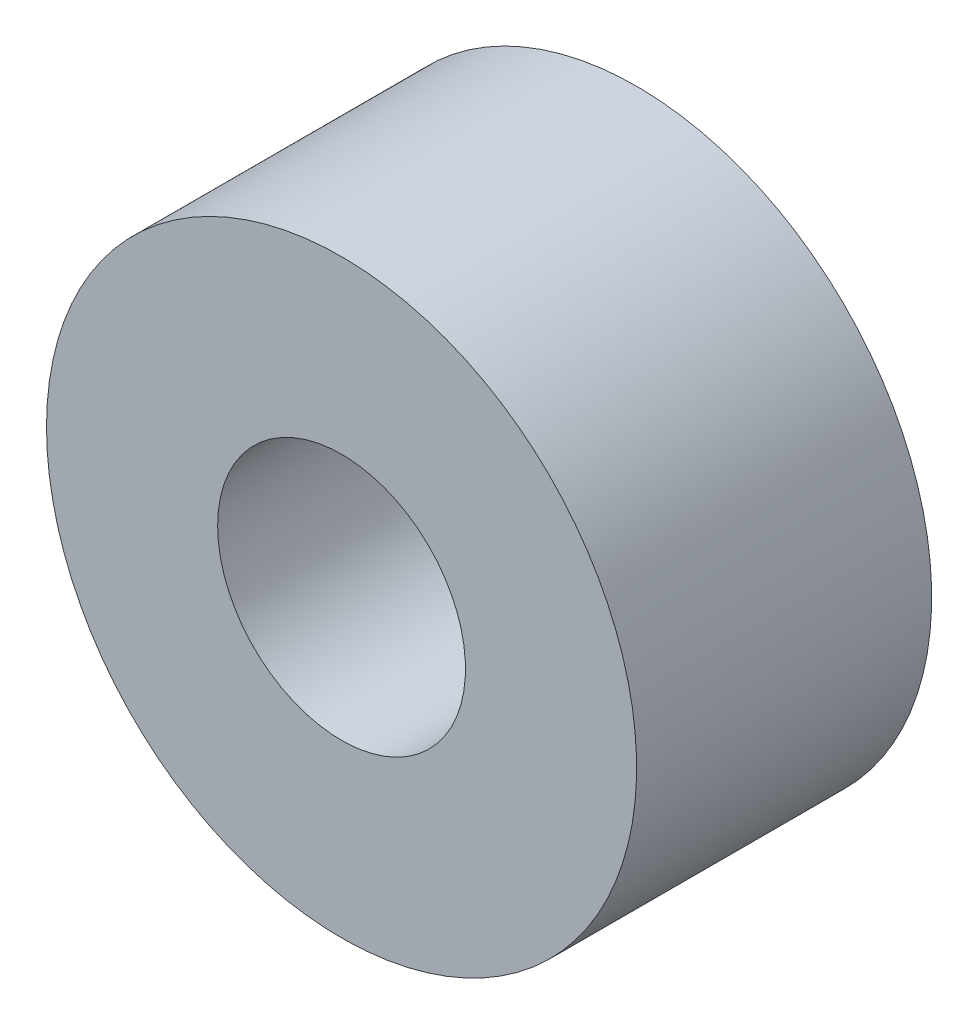
ISO-10303-21;
HEADER;
FILE_DESCRIPTION(('STEP AP214'),'2;1');
FILE_NAME('part.step','',(''),(''),'','','');
FILE_SCHEMA(('AUTOMOTIVE_DESIGN { 1 0 10303 214 1 1 1 1 }'));
ENDSEC;
DATA;
#1=APPLICATION_CONTEXT('core data for automotive mechanical design processes');
#2=APPLICATION_PROTOCOL_DEFINITION('international standard','automotive_design',2000,#1);
#3=PRODUCT_CONTEXT('',#1,'mechanical');
#4=PRODUCT('Part','Part','',(#3));
#5=PRODUCT_RELATED_PRODUCT_CATEGORY('part','',(#4));
#6=PRODUCT_DEFINITION_FORMATION('','',#4);
#7=PRODUCT_DEFINITION_CONTEXT('part definition',#1,'design');
#8=PRODUCT_DEFINITION('design','',#6,#7);
#9=PRODUCT_DEFINITION_SHAPE('','',#8);
#10=(LENGTH_UNIT() NAMED_UNIT(*) SI_UNIT(.MILLI.,.METRE.));
#11=(NAMED_UNIT(*) PLANE_ANGLE_UNIT() SI_UNIT($,.RADIAN.));
#12=(NAMED_UNIT(*) SI_UNIT($,.STERADIAN.) SOLID_ANGLE_UNIT());
#13=UNCERTAINTY_MEASURE_WITH_UNIT(LENGTH_MEASURE(1.E-05),#10,'distance_accuracy_value','');
#14=(GEOMETRIC_REPRESENTATION_CONTEXT(3) GLOBAL_UNCERTAINTY_ASSIGNED_CONTEXT((#13)) GLOBAL_UNIT_ASSIGNED_CONTEXT((#10,
#11,#12)) REPRESENTATION_CONTEXT('',''));
#15=CARTESIAN_POINT('',(0.,0.,0.));
#16=DIRECTION('',(0.,0.,1.));
#17=DIRECTION('',(1.,0.,0.));
#18=AXIS2_PLACEMENT_3D('',#15,#16,#17);
#19=CARTESIAN_POINT('',(0.,0.,4.7625));
#20=DIRECTION('',(0.,0.,1.));
#21=DIRECTION('',(1.,0.,0.));
#22=AXIS2_PLACEMENT_3D('',#19,#20,#21);
#23=PLANE('',#22);
#24=CARTESIAN_POINT('',(0.,0.,4.7625));
#25=DIRECTION('',(0.,0.,1.));
#26=DIRECTION('',(1.,0.,0.));
#27=AXIS2_PLACEMENT_3D('',#24,#25,#26);
#28=CIRCLE('',#27,9.525);
#29=CARTESIAN_POINT('',(-9.525,0.,4.7625));
#30=VERTEX_POINT('',#29);
#31=EDGE_CURVE('E10',#30,#30,#28,.T.);
#32=ORIENTED_EDGE('',*,*,#31,.T.);
#33=EDGE_LOOP('',(#32));
#34=FACE_BOUND('',#33,.T.);
#35=CARTESIAN_POINT('',(0.,0.,4.7625));
#36=DIRECTION('',(0.,0.,1.));
#37=DIRECTION('',(1.,0.,0.));
#38=AXIS2_PLACEMENT_3D('',#35,#36,#37);
#39=CIRCLE('',#38,4.0005);
#40=CARTESIAN_POINT('',(-4.0005,0.,4.7625));
#41=VERTEX_POINT('',#40);
#42=EDGE_CURVE('E44',#41,#41,#39,.T.);
#43=ORIENTED_EDGE('',*,*,#42,.F.);
#44=EDGE_LOOP('',(#43));
#45=FACE_BOUND('',#44,.T.);
#46=ADVANCED_FACE('F33',(#34,#45),#23,.T.);
#47=CARTESIAN_POINT('',(0.,0.,-4.7625));
#48=DIRECTION('',(0.,0.,1.));
#49=DIRECTION('',(1.,0.,0.));
#50=AXIS2_PLACEMENT_3D('',#47,#48,#49);
#51=PLANE('',#50);
#52=CARTESIAN_POINT('',(0.,0.,-4.7625));
#53=DIRECTION('',(0.,0.,1.));
#54=DIRECTION('',(1.,0.,0.));
#55=AXIS2_PLACEMENT_3D('',#52,#53,#54);
#56=CIRCLE('',#55,9.525);
#57=CARTESIAN_POINT('',(-9.525,0.,-4.7625));
#58=VERTEX_POINT('',#57);
#59=EDGE_CURVE('E37',#58,#58,#56,.T.);
#60=ORIENTED_EDGE('',*,*,#59,.F.);
#61=EDGE_LOOP('',(#60));
#62=FACE_BOUND('',#61,.T.);
#63=CARTESIAN_POINT('',(0.,0.,-4.7625));
#64=DIRECTION('',(0.,0.,1.));
#65=DIRECTION('',(1.,0.,0.));
#66=AXIS2_PLACEMENT_3D('',#63,#64,#65);
#67=CIRCLE('',#66,4.0005);
#68=CARTESIAN_POINT('',(-4.0005,0.,-4.7625));
#69=VERTEX_POINT('',#68);
#70=EDGE_CURVE('E46',#69,#69,#67,.T.);
#71=ORIENTED_EDGE('',*,*,#70,.T.);
#72=EDGE_LOOP('',(#71));
#73=FACE_BOUND('',#72,.T.);
#74=ADVANCED_FACE('F56',(#62,#73),#51,.F.);
#75=CARTESIAN_POINT('',(0.,0.,4.7625));
#76=DIRECTION('',(0.,0.,-1.));
#77=DIRECTION('',(-1.,0.,0.));
#78=AXIS2_PLACEMENT_3D('',#75,#76,#77);
#79=CYLINDRICAL_SURFACE('',#78,9.525);
#80=CARTESIAN_POINT('',(-9.525,0.,4.7625));
#81=CARTESIAN_POINT('',(-9.525,0.,4.66328125));
#82=CARTESIAN_POINT('',(-9.525,0.,4.5640625));
#83=CARTESIAN_POINT('',(-9.525,0.,4.365625));
#84=CARTESIAN_POINT('',(-9.525,0.,4.26640625));
#85=CARTESIAN_POINT('',(-9.525,0.,4.06796875));
#86=CARTESIAN_POINT('',(-9.525,0.,3.96875));
#87=CARTESIAN_POINT('',(-9.525,0.,3.7703125));
#88=CARTESIAN_POINT('',(-9.525,0.,3.67109375));
#89=CARTESIAN_POINT('',(-9.525,0.,3.47265625));
#90=CARTESIAN_POINT('',(-9.525,0.,3.3734375));
#91=CARTESIAN_POINT('',(-9.525,0.,3.175));
#92=CARTESIAN_POINT('',(-9.525,0.,3.07578125));
#93=CARTESIAN_POINT('',(-9.525,0.,2.87734375));
#94=CARTESIAN_POINT('',(-9.525,0.,2.778125));
#95=CARTESIAN_POINT('',(-9.525,0.,2.5796875));
#96=CARTESIAN_POINT('',(-9.525,0.,2.48046875));
#97=CARTESIAN_POINT('',(-9.525,0.,2.28203125));
#98=CARTESIAN_POINT('',(-9.525,0.,2.1828125));
#99=CARTESIAN_POINT('',(-9.525,0.,1.984375));
#100=CARTESIAN_POINT('',(-9.525,0.,1.88515625));
#101=CARTESIAN_POINT('',(-9.525,0.,1.68671875));
#102=CARTESIAN_POINT('',(-9.525,0.,1.5875));
#103=CARTESIAN_POINT('',(-9.525,0.,1.3890625));
#104=CARTESIAN_POINT('',(-9.525,0.,1.28984375));
#105=CARTESIAN_POINT('',(-9.525,0.,1.09140625));
#106=CARTESIAN_POINT('',(-9.525,0.,0.992187499999999));
#107=CARTESIAN_POINT('',(-9.525,0.,0.79375));
#108=CARTESIAN_POINT('',(-9.525,0.,0.69453125));
#109=CARTESIAN_POINT('',(-9.525,0.,0.49609375));
#110=CARTESIAN_POINT('',(-9.525,0.,0.396875));
#111=CARTESIAN_POINT('',(-9.525,0.,0.1984375));
#112=CARTESIAN_POINT('',(-9.525,0.,0.0992187500000001));
#113=CARTESIAN_POINT('',(-9.525,0.,-0.0992187500000001));
#114=CARTESIAN_POINT('',(-9.525,0.,-0.1984375));
#115=CARTESIAN_POINT('',(-9.525,0.,-0.396875));
#116=CARTESIAN_POINT('',(-9.525,0.,-0.49609375));
#117=CARTESIAN_POINT('',(-9.525,0.,-0.69453125));
#118=CARTESIAN_POINT('',(-9.525,0.,-0.793750000000001));
#119=CARTESIAN_POINT('',(-9.525,0.,-0.992187500000001));
#120=CARTESIAN_POINT('',(-9.525,0.,-1.09140625));
#121=CARTESIAN_POINT('',(-9.525,0.,-1.28984375));
#122=CARTESIAN_POINT('',(-9.525,0.,-1.3890625));
#123=CARTESIAN_POINT('',(-9.525,0.,-1.5875));
#124=CARTESIAN_POINT('',(-9.525,0.,-1.68671875));
#125=CARTESIAN_POINT('',(-9.525,0.,-1.88515625));
#126=CARTESIAN_POINT('',(-9.525,0.,-1.984375));
#127=CARTESIAN_POINT('',(-9.525,0.,-2.1828125));
#128=CARTESIAN_POINT('',(-9.525,0.,-2.28203125));
#129=CARTESIAN_POINT('',(-9.525,0.,-2.48046875));
#130=CARTESIAN_POINT('',(-9.525,0.,-2.5796875));
#131=CARTESIAN_POINT('',(-9.525,0.,-2.778125));
#132=CARTESIAN_POINT('',(-9.525,0.,-2.87734375));
#133=CARTESIAN_POINT('',(-9.525,0.,-3.07578125));
#134=CARTESIAN_POINT('',(-9.525,0.,-3.175));
#135=CARTESIAN_POINT('',(-9.525,0.,-3.3734375));
#136=CARTESIAN_POINT('',(-9.525,0.,-3.47265625));
#137=CARTESIAN_POINT('',(-9.525,0.,-3.67109375));
#138=CARTESIAN_POINT('',(-9.525,0.,-3.7703125));
#139=CARTESIAN_POINT('',(-9.525,0.,-3.96875));
#140=CARTESIAN_POINT('',(-9.525,0.,-4.06796875));
#141=CARTESIAN_POINT('',(-9.525,0.,-4.26640625));
#142=CARTESIAN_POINT('',(-9.525,0.,-4.365625));
#143=CARTESIAN_POINT('',(-9.525,0.,-4.5640625));
#144=CARTESIAN_POINT('',(-9.525,0.,-4.66328125));
#145=CARTESIAN_POINT('',(-9.525,0.,-4.7625));
#146=B_SPLINE_CURVE_WITH_KNOTS('',3,(#80,#81,#82,#83,#84,#85,#86,#87,#88,#89,#90,#91,#92,#93,
#94,#95,#96,#97,#98,#99,#100,#101,#102,#103,#104,#105,#106,#107,#108,#109,#110,#111,#112,#113,
#114,#115,#116,#117,#118,#119,#120,#121,#122,#123,#124,#125,#126,#127,#128,#129,#130,#131,#132,
#133,#134,#135,#136,#137,#138,#139,#140,#141,#142,#143,#144,#145),.UNSPECIFIED.,.F.,.F.,(4,2,2,
2,2,2,2,2,2,2,2,2,2,2,2,2,2,2,2,2,2,2,2,2,2,2,2,2,2,2,2,2,4),(0.,0.29765625,0.5953125,
0.892968750000001,1.190625,1.48828125,1.7859375,2.08359375,2.38125,2.67890625,2.9765625,
3.27421875,3.571875,3.86953125,4.1671875,4.46484375,4.7625,5.06015625,5.3578125,5.65546875,
5.953125,6.25078125,6.5484375,6.84609375,7.14375,7.44140625,7.7390625,8.03671875,8.334375,
8.63203125,8.9296875,9.22734375,9.525),.UNSPECIFIED.);
#147=EDGE_CURVE('BSEAM35',#30,#58,#146,.T.);
#148=ORIENTED_EDGE('',*,*,#31,.F.);
#149=ORIENTED_EDGE('',*,*,#59,.T.);
#150=ORIENTED_EDGE('',*,*,#147,.T.);
#151=ORIENTED_EDGE('',*,*,#147,.F.);
#152=EDGE_LOOP('',(#148,#150,#149,#151));
#153=FACE_BOUND('',#152,.T.);
#154=ADVANCED_FACE('F35',(#153),#79,.T.);
#155=CARTESIAN_POINT('',(0.,0.,4.7625));
#156=DIRECTION('',(0.,0.,-1.));
#157=DIRECTION('',(-1.,0.,0.));
#158=AXIS2_PLACEMENT_3D('',#155,#156,#157);
#159=CYLINDRICAL_SURFACE('',#158,4.0005);
#160=CARTESIAN_POINT('',(-4.0005,0.,4.7625));
#161=CARTESIAN_POINT('',(-4.0005,0.,4.66328125));
#162=CARTESIAN_POINT('',(-4.0005,0.,4.5640625));
#163=CARTESIAN_POINT('',(-4.0005,0.,4.365625));
#164=CARTESIAN_POINT('',(-4.0005,0.,4.26640625));
#165=CARTESIAN_POINT('',(-4.0005,0.,4.06796875));
#166=CARTESIAN_POINT('',(-4.0005,0.,3.96875));
#167=CARTESIAN_POINT('',(-4.0005,0.,3.7703125));
#168=CARTESIAN_POINT('',(-4.0005,0.,3.67109375));
#169=CARTESIAN_POINT('',(-4.0005,0.,3.47265625));
#170=CARTESIAN_POINT('',(-4.0005,0.,3.3734375));
#171=CARTESIAN_POINT('',(-4.0005,0.,3.175));
#172=CARTESIAN_POINT('',(-4.0005,0.,3.07578125));
#173=CARTESIAN_POINT('',(-4.0005,0.,2.87734375));
#174=CARTESIAN_POINT('',(-4.0005,0.,2.778125));
#175=CARTESIAN_POINT('',(-4.0005,0.,2.5796875));
#176=CARTESIAN_POINT('',(-4.0005,0.,2.48046875));
#177=CARTESIAN_POINT('',(-4.0005,0.,2.28203125));
#178=CARTESIAN_POINT('',(-4.0005,0.,2.1828125));
#179=CARTESIAN_POINT('',(-4.0005,0.,1.984375));
#180=CARTESIAN_POINT('',(-4.0005,0.,1.88515625));
#181=CARTESIAN_POINT('',(-4.0005,0.,1.68671875));
#182=CARTESIAN_POINT('',(-4.0005,0.,1.5875));
#183=CARTESIAN_POINT('',(-4.0005,0.,1.3890625));
#184=CARTESIAN_POINT('',(-4.0005,0.,1.28984375));
#185=CARTESIAN_POINT('',(-4.0005,0.,1.09140625));
#186=CARTESIAN_POINT('',(-4.0005,0.,0.992187499999999));
#187=CARTESIAN_POINT('',(-4.0005,0.,0.793749999999999));
#188=CARTESIAN_POINT('',(-4.0005,0.,0.694531249999999));
#189=CARTESIAN_POINT('',(-4.0005,0.,0.496093749999999));
#190=CARTESIAN_POINT('',(-4.0005,0.,0.396874999999999));
#191=CARTESIAN_POINT('',(-4.0005,0.,0.198437499999999));
#192=CARTESIAN_POINT('',(-4.0005,0.,0.0992187499999992));
#193=CARTESIAN_POINT('',(-4.0005,0.,-0.0992187500000009));
#194=CARTESIAN_POINT('',(-4.0005,0.,-0.198437500000001));
#195=CARTESIAN_POINT('',(-4.0005,0.,-0.396875000000001));
#196=CARTESIAN_POINT('',(-4.0005,0.,-0.496093750000001));
#197=CARTESIAN_POINT('',(-4.0005,0.,-0.694531250000001));
#198=CARTESIAN_POINT('',(-4.0005,0.,-0.793750000000001));
#199=CARTESIAN_POINT('',(-4.0005,0.,-0.992187500000002));
#200=CARTESIAN_POINT('',(-4.0005,0.,-1.09140625));
#201=CARTESIAN_POINT('',(-4.0005,0.,-1.28984375));
#202=CARTESIAN_POINT('',(-4.0005,0.,-1.3890625));
#203=CARTESIAN_POINT('',(-4.0005,0.,-1.5875));
#204=CARTESIAN_POINT('',(-4.0005,0.,-1.68671875));
#205=CARTESIAN_POINT('',(-4.0005,0.,-1.88515625));
#206=CARTESIAN_POINT('',(-4.0005,0.,-1.984375));
#207=CARTESIAN_POINT('',(-4.0005,0.,-2.1828125));
#208=CARTESIAN_POINT('',(-4.0005,0.,-2.28203125));
#209=CARTESIAN_POINT('',(-4.0005,0.,-2.48046875));
#210=CARTESIAN_POINT('',(-4.0005,0.,-2.5796875));
#211=CARTESIAN_POINT('',(-4.0005,0.,-2.778125));
#212=CARTESIAN_POINT('',(-4.0005,0.,-2.87734375));
#213=CARTESIAN_POINT('',(-4.0005,0.,-3.07578125));
#214=CARTESIAN_POINT('',(-4.0005,0.,-3.175));
#215=CARTESIAN_POINT('',(-4.0005,0.,-3.3734375));
#216=CARTESIAN_POINT('',(-4.0005,0.,-3.47265625));
#217=CARTESIAN_POINT('',(-4.0005,0.,-3.67109375));
#218=CARTESIAN_POINT('',(-4.0005,0.,-3.7703125));
#219=CARTESIAN_POINT('',(-4.0005,0.,-3.96875));
#220=CARTESIAN_POINT('',(-4.0005,0.,-4.06796875));
#221=CARTESIAN_POINT('',(-4.0005,0.,-4.26640625));
#222=CARTESIAN_POINT('',(-4.0005,0.,-4.365625));
#223=CARTESIAN_POINT('',(-4.0005,0.,-4.5640625));
#224=CARTESIAN_POINT('',(-4.0005,0.,-4.66328125));
#225=CARTESIAN_POINT('',(-4.0005,0.,-4.7625));
#226=B_SPLINE_CURVE_WITH_KNOTS('',3,(#160,#161,#162,#163,#164,#165,#166,#167,#168,#169,#170,
#171,#172,#173,#174,#175,#176,#177,#178,#179,#180,#181,#182,#183,#184,#185,#186,#187,#188,#189,
#190,#191,#192,#193,#194,#195,#196,#197,#198,#199,#200,#201,#202,#203,#204,#205,#206,#207,#208,
#209,#210,#211,#212,#213,#214,#215,#216,#217,#218,#219,#220,#221,#222,#223,#224,#225),
.UNSPECIFIED.,.F.,.F.,(4,2,2,2,2,2,2,2,2,2,2,2,2,2,2,2,2,2,2,2,2,2,2,2,2,2,2,2,2,2,2,2,4),(0.,
0.297656249999999,0.595312499999999,0.89296875,1.190625,1.48828125,1.7859375,2.08359375,2.38125,
2.67890625,2.9765625,3.27421875,3.571875,3.86953125,4.1671875,4.46484375,4.7625,5.06015625,
5.3578125,5.65546875,5.953125,6.25078125,6.5484375,6.84609375,7.14375,7.44140625,7.7390625,
8.03671875,8.334375,8.63203125,8.9296875,9.22734375,9.525),.UNSPECIFIED.);
#227=EDGE_CURVE('BSEAM52',#41,#69,#226,.T.);
#228=ORIENTED_EDGE('',*,*,#42,.T.);
#229=ORIENTED_EDGE('',*,*,#70,.F.);
#230=ORIENTED_EDGE('',*,*,#227,.T.);
#231=ORIENTED_EDGE('',*,*,#227,.F.);
#232=EDGE_LOOP('',(#228,#230,#229,#231));
#233=FACE_BOUND('',#232,.T.);
#234=ADVANCED_FACE('F52',(#233),#159,.F.);
#235=CLOSED_SHELL('',(#46,#74,#154,#234));
#236=MANIFOLD_SOLID_BREP('B2',#235);
#237=ADVANCED_BREP_SHAPE_REPRESENTATION('',(#18,#236),#14);
#238=SHAPE_DEFINITION_REPRESENTATION(#9,#237);
ENDSEC;
END-ISO-10303-21;
